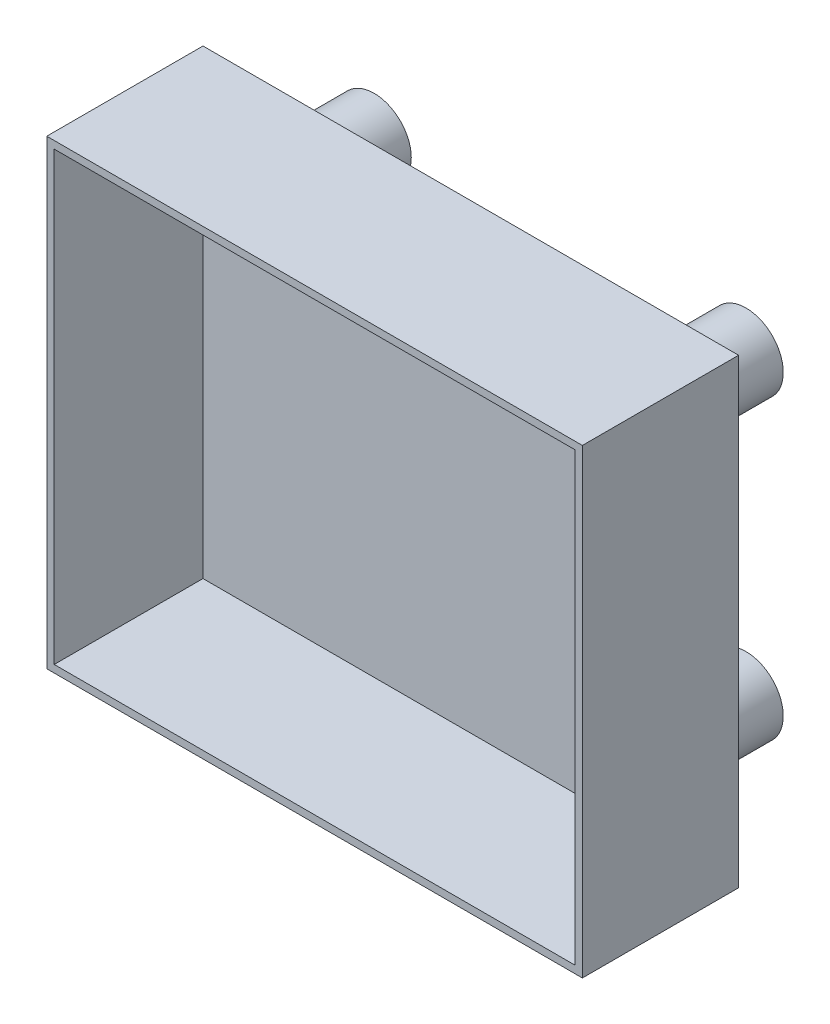
ISO-10303-21;
HEADER;
FILE_DESCRIPTION(('STEP AP214'),'2;1');
FILE_NAME('part.step','',(''),(''),'','','');
FILE_SCHEMA(('AUTOMOTIVE_DESIGN { 1 0 10303 214 1 1 1 1 }'));
ENDSEC;
DATA;
#1=APPLICATION_CONTEXT('core data for automotive mechanical design processes');
#2=APPLICATION_PROTOCOL_DEFINITION('international standard','automotive_design',2000,#1);
#3=PRODUCT_CONTEXT('',#1,'mechanical');
#4=PRODUCT('Part','Part','',(#3));
#5=PRODUCT_RELATED_PRODUCT_CATEGORY('part','',(#4));
#6=PRODUCT_DEFINITION_FORMATION('','',#4);
#7=PRODUCT_DEFINITION_CONTEXT('part definition',#1,'design');
#8=PRODUCT_DEFINITION('design','',#6,#7);
#9=PRODUCT_DEFINITION_SHAPE('','',#8);
#10=(LENGTH_UNIT() NAMED_UNIT(*) SI_UNIT(.MILLI.,.METRE.));
#11=(NAMED_UNIT(*) PLANE_ANGLE_UNIT() SI_UNIT($,.RADIAN.));
#12=(NAMED_UNIT(*) SI_UNIT($,.STERADIAN.) SOLID_ANGLE_UNIT());
#13=UNCERTAINTY_MEASURE_WITH_UNIT(LENGTH_MEASURE(1.E-05),#10,'distance_accuracy_value','');
#14=(GEOMETRIC_REPRESENTATION_CONTEXT(3) GLOBAL_UNCERTAINTY_ASSIGNED_CONTEXT((#13)) GLOBAL_UNIT_ASSIGNED_CONTEXT((#10,
#11,#12)) REPRESENTATION_CONTEXT('',''));
#15=CARTESIAN_POINT('',(0.,0.,0.));
#16=DIRECTION('',(0.,0.,1.));
#17=DIRECTION('',(1.,0.,0.));
#18=AXIS2_PLACEMENT_3D('',#15,#16,#17);
#19=CARTESIAN_POINT('',(0.,0.,50.8));
#20=DIRECTION('',(0.,0.,-1.));
#21=DIRECTION('',(-1.,0.,0.));
#22=AXIS2_PLACEMENT_3D('',#19,#20,#21);
#23=PLANE('',#22);
#24=DIRECTION('',(0.,1.,0.));
#25=VECTOR('',#24,1.);
#26=CARTESIAN_POINT('',(91.44,0.,50.8));
#27=LINE('',#26,#25);
#28=CARTESIAN_POINT('',(91.44,-78.74,50.8));
#29=VERTEX_POINT('',#28);
#30=CARTESIAN_POINT('',(91.44,78.74,50.8));
#31=VERTEX_POINT('',#30);
#32=EDGE_CURVE('E163',#29,#31,#27,.T.);
#33=ORIENTED_EDGE('',*,*,#32,.T.);
#34=DIRECTION('',(-1.,0.,0.));
#35=VECTOR('',#34,1.);
#36=CARTESIAN_POINT('',(0.,78.74,50.8));
#37=LINE('',#36,#35);
#38=CARTESIAN_POINT('',(-91.44,78.74,50.8));
#39=VERTEX_POINT('',#38);
#40=EDGE_CURVE('E165',#31,#39,#37,.T.);
#41=ORIENTED_EDGE('',*,*,#40,.T.);
#42=DIRECTION('',(0.,-1.,0.));
#43=VECTOR('',#42,1.);
#44=CARTESIAN_POINT('',(-91.44,0.,50.8));
#45=LINE('',#44,#43);
#46=CARTESIAN_POINT('',(-91.44,-78.74,50.8));
#47=VERTEX_POINT('',#46);
#48=EDGE_CURVE('E166',#39,#47,#45,.T.);
#49=ORIENTED_EDGE('',*,*,#48,.T.);
#50=DIRECTION('',(1.,0.,0.));
#51=VECTOR('',#50,1.);
#52=CARTESIAN_POINT('',(0.,-78.74,50.8));
#53=LINE('',#52,#51);
#54=EDGE_CURVE('E37',#47,#29,#53,.T.);
#55=ORIENTED_EDGE('',*,*,#54,.T.);
#56=EDGE_LOOP('',(#33,#41,#49,#55));
#57=FACE_BOUND('',#56,.T.);
#58=DIRECTION('',(0.,1.,0.));
#59=VECTOR('',#58,1.);
#60=CARTESIAN_POINT('',(88.9,-76.2,50.8));
#61=LINE('',#60,#59);
#62=CARTESIAN_POINT('',(88.9,-76.2,50.8));
#63=VERTEX_POINT('',#62);
#64=CARTESIAN_POINT('',(88.9,76.2,50.8));
#65=VERTEX_POINT('',#64);
#66=EDGE_CURVE('E102',#63,#65,#61,.T.);
#67=ORIENTED_EDGE('',*,*,#66,.F.);
#68=DIRECTION('',(1.,0.,0.));
#69=VECTOR('',#68,1.);
#70=CARTESIAN_POINT('',(-88.9,-76.2,50.8));
#71=LINE('',#70,#69);
#72=CARTESIAN_POINT('',(-88.9,-76.2,50.8));
#73=VERTEX_POINT('',#72);
#74=EDGE_CURVE('E127',#73,#63,#71,.T.);
#75=ORIENTED_EDGE('',*,*,#74,.F.);
#76=DIRECTION('',(0.,-1.,0.));
#77=VECTOR('',#76,1.);
#78=CARTESIAN_POINT('',(-88.9,-76.2,50.8));
#79=LINE('',#78,#77);
#80=CARTESIAN_POINT('',(-88.9,76.2,50.8));
#81=VERTEX_POINT('',#80);
#82=EDGE_CURVE('E125',#81,#73,#79,.T.);
#83=ORIENTED_EDGE('',*,*,#82,.F.);
#84=DIRECTION('',(-1.,0.,0.));
#85=VECTOR('',#84,1.);
#86=CARTESIAN_POINT('',(-88.9,76.2,50.8));
#87=LINE('',#86,#85);
#88=EDGE_CURVE('E113',#65,#81,#87,.T.);
#89=ORIENTED_EDGE('',*,*,#88,.F.);
#90=EDGE_LOOP('',(#67,#75,#83,#89));
#91=FACE_BOUND('',#90,.T.);
#92=ADVANCED_FACE('F33',(#57,#91),#23,.F.);
#93=CARTESIAN_POINT('',(91.44,-76.2,50.8));
#94=DIRECTION('',(-1.,0.,0.));
#95=DIRECTION('',(0.,0.,1.));
#96=AXIS2_PLACEMENT_3D('',#93,#94,#95);
#97=PLANE('',#96);
#98=DIRECTION('',(0.,1.,0.));
#99=VECTOR('',#98,1.);
#100=CARTESIAN_POINT('',(91.44,0.,-2.54));
#101=LINE('',#100,#99);
#102=CARTESIAN_POINT('',(91.44,-78.74,-2.54));
#103=VERTEX_POINT('',#102);
#104=CARTESIAN_POINT('',(91.44,78.74,-2.54));
#105=VERTEX_POINT('',#104);
#106=EDGE_CURVE('E121',#103,#105,#101,.T.);
#107=ORIENTED_EDGE('',*,*,#106,.T.);
#108=DIRECTION('',(0.,0.,-1.));
#109=VECTOR('',#108,1.);
#110=CARTESIAN_POINT('',(91.44,78.74,50.8));
#111=LINE('',#110,#109);
#112=EDGE_CURVE('E145',#31,#105,#111,.T.);
#113=ORIENTED_EDGE('',*,*,#112,.F.);
#114=ORIENTED_EDGE('',*,*,#32,.F.);
#115=DIRECTION('',(0.,0.,-1.));
#116=VECTOR('',#115,1.);
#117=CARTESIAN_POINT('',(91.44,-78.74,50.8));
#118=LINE('',#117,#116);
#119=EDGE_CURVE('E150',#29,#103,#118,.T.);
#120=ORIENTED_EDGE('',*,*,#119,.T.);
#121=EDGE_LOOP('',(#107,#113,#114,#120));
#122=FACE_BOUND('',#121,.T.);
#123=ADVANCED_FACE('F180',(#122),#97,.F.);
#124=CARTESIAN_POINT('',(-88.9,78.74,50.8));
#125=DIRECTION('',(0.,-1.,0.));
#126=DIRECTION('',(0.,0.,-1.));
#127=AXIS2_PLACEMENT_3D('',#124,#125,#126);
#128=PLANE('',#127);
#129=DIRECTION('',(-1.,0.,0.));
#130=VECTOR('',#129,1.);
#131=CARTESIAN_POINT('',(0.,78.74,-2.54));
#132=LINE('',#131,#130);
#133=CARTESIAN_POINT('',(-91.44,78.74,-2.54));
#134=VERTEX_POINT('',#133);
#135=EDGE_CURVE('E144',#105,#134,#132,.T.);
#136=ORIENTED_EDGE('',*,*,#135,.T.);
#137=DIRECTION('',(0.,0.,-1.));
#138=VECTOR('',#137,1.);
#139=CARTESIAN_POINT('',(-91.44,78.74,50.8));
#140=LINE('',#139,#138);
#141=EDGE_CURVE('E149',#39,#134,#140,.T.);
#142=ORIENTED_EDGE('',*,*,#141,.F.);
#143=ORIENTED_EDGE('',*,*,#40,.F.);
#144=ORIENTED_EDGE('',*,*,#112,.T.);
#145=EDGE_LOOP('',(#136,#142,#143,#144));
#146=FACE_BOUND('',#145,.T.);
#147=ADVANCED_FACE('F182',(#146),#128,.F.);
#148=CARTESIAN_POINT('',(-91.44,-76.2,50.8));
#149=DIRECTION('',(1.,0.,0.));
#150=DIRECTION('',(0.,0.,-1.));
#151=AXIS2_PLACEMENT_3D('',#148,#149,#150);
#152=PLANE('',#151);
#153=DIRECTION('',(0.,-1.,0.));
#154=VECTOR('',#153,1.);
#155=CARTESIAN_POINT('',(-91.44,0.,-2.54));
#156=LINE('',#155,#154);
#157=CARTESIAN_POINT('',(-91.44,-78.74,-2.54));
#158=VERTEX_POINT('',#157);
#159=EDGE_CURVE('E155',#134,#158,#156,.T.);
#160=ORIENTED_EDGE('',*,*,#159,.T.);
#161=DIRECTION('',(0.,0.,-1.));
#162=VECTOR('',#161,1.);
#163=CARTESIAN_POINT('',(-91.44,-78.74,50.8));
#164=LINE('',#163,#162);
#165=EDGE_CURVE('E153',#47,#158,#164,.T.);
#166=ORIENTED_EDGE('',*,*,#165,.F.);
#167=ORIENTED_EDGE('',*,*,#48,.F.);
#168=ORIENTED_EDGE('',*,*,#141,.T.);
#169=EDGE_LOOP('',(#160,#166,#167,#168));
#170=FACE_BOUND('',#169,.T.);
#171=ADVANCED_FACE('F171',(#170),#152,.F.);
#172=CARTESIAN_POINT('',(-88.9,-78.74,50.8));
#173=DIRECTION('',(0.,1.,0.));
#174=DIRECTION('',(0.,0.,1.));
#175=AXIS2_PLACEMENT_3D('',#172,#173,#174);
#176=PLANE('',#175);
#177=DIRECTION('',(1.,0.,0.));
#178=VECTOR('',#177,1.);
#179=CARTESIAN_POINT('',(0.,-78.74,-2.54));
#180=LINE('',#179,#178);
#181=EDGE_CURVE('E159',#158,#103,#180,.T.);
#182=ORIENTED_EDGE('',*,*,#181,.T.);
#183=ORIENTED_EDGE('',*,*,#119,.F.);
#184=ORIENTED_EDGE('',*,*,#54,.F.);
#185=ORIENTED_EDGE('',*,*,#165,.T.);
#186=EDGE_LOOP('',(#182,#183,#184,#185));
#187=FACE_BOUND('',#186,.T.);
#188=ADVANCED_FACE('F175',(#187),#176,.F.);
#189=CARTESIAN_POINT('',(0.,0.,-2.54));
#190=DIRECTION('',(0.,0.,-1.));
#191=DIRECTION('',(-1.,0.,0.));
#192=AXIS2_PLACEMENT_3D('',#189,#190,#191);
#193=PLANE('',#192);
#194=CARTESIAN_POINT('',(-63.5,50.8,-2.54));
#195=DIRECTION('',(0.,0.,-1.));
#196=DIRECTION('',(-1.,0.,0.));
#197=AXIS2_PLACEMENT_3D('',#194,#195,#196);
#198=CIRCLE('',#197,12.7);
#199=CARTESIAN_POINT('',(-76.2,50.8,-2.54));
#200=VERTEX_POINT('',#199);
#201=EDGE_CURVE('E11',#200,#200,#198,.T.);
#202=ORIENTED_EDGE('',*,*,#201,.F.);
#203=EDGE_LOOP('',(#202));
#204=FACE_BOUND('',#203,.T.);
#205=CARTESIAN_POINT('',(63.5,50.8,-2.54));
#206=DIRECTION('',(0.,0.,-1.));
#207=DIRECTION('',(-1.,0.,0.));
#208=AXIS2_PLACEMENT_3D('',#205,#206,#207);
#209=CIRCLE('',#208,12.7);
#210=CARTESIAN_POINT('',(50.8,50.8,-2.54));
#211=VERTEX_POINT('',#210);
#212=EDGE_CURVE('E42',#211,#211,#209,.T.);
#213=ORIENTED_EDGE('',*,*,#212,.F.);
#214=EDGE_LOOP('',(#213));
#215=FACE_BOUND('',#214,.T.);
#216=CARTESIAN_POINT('',(63.5,-50.8,-2.54));
#217=DIRECTION('',(0.,0.,-1.));
#218=DIRECTION('',(-1.,0.,0.));
#219=AXIS2_PLACEMENT_3D('',#216,#217,#218);
#220=CIRCLE('',#219,12.7);
#221=CARTESIAN_POINT('',(50.8,-50.8,-2.54));
#222=VERTEX_POINT('',#221);
#223=EDGE_CURVE('E356',#222,#222,#220,.T.);
#224=ORIENTED_EDGE('',*,*,#223,.F.);
#225=EDGE_LOOP('',(#224));
#226=FACE_BOUND('',#225,.T.);
#227=CARTESIAN_POINT('',(-63.5,-50.8,-2.54));
#228=DIRECTION('',(0.,0.,-1.));
#229=DIRECTION('',(-1.,0.,0.));
#230=AXIS2_PLACEMENT_3D('',#227,#228,#229);
#231=CIRCLE('',#230,12.7);
#232=CARTESIAN_POINT('',(-76.2,-50.8,-2.54));
#233=VERTEX_POINT('',#232);
#234=EDGE_CURVE('E148',#233,#233,#231,.T.);
#235=ORIENTED_EDGE('',*,*,#234,.F.);
#236=EDGE_LOOP('',(#235));
#237=FACE_BOUND('',#236,.T.);
#238=ORIENTED_EDGE('',*,*,#106,.F.);
#239=ORIENTED_EDGE('',*,*,#181,.F.);
#240=ORIENTED_EDGE('',*,*,#159,.F.);
#241=ORIENTED_EDGE('',*,*,#135,.F.);
#242=EDGE_LOOP('',(#238,#239,#240,#241));
#243=FACE_BOUND('',#242,.T.);
#244=ADVANCED_FACE('F35',(#204,#215,#226,#237,#243),#193,.T.);
#245=CARTESIAN_POINT('',(88.9,-76.2,50.8));
#246=DIRECTION('',(-1.,0.,0.));
#247=DIRECTION('',(0.,0.,1.));
#248=AXIS2_PLACEMENT_3D('',#245,#246,#247);
#249=PLANE('',#248);
#250=DIRECTION('',(0.,1.,0.));
#251=VECTOR('',#250,1.);
#252=CARTESIAN_POINT('',(88.9,-76.2,0.));
#253=LINE('',#252,#251);
#254=CARTESIAN_POINT('',(88.9,-76.2,0.));
#255=VERTEX_POINT('',#254);
#256=CARTESIAN_POINT('',(88.9,76.2,0.));
#257=VERTEX_POINT('',#256);
#258=EDGE_CURVE('E132',#255,#257,#253,.T.);
#259=ORIENTED_EDGE('',*,*,#258,.F.);
#260=DIRECTION('',(0.,0.,-1.));
#261=VECTOR('',#260,1.);
#262=CARTESIAN_POINT('',(88.9,-76.2,50.8));
#263=LINE('',#262,#261);
#264=EDGE_CURVE('E109',#63,#255,#263,.T.);
#265=ORIENTED_EDGE('',*,*,#264,.F.);
#266=ORIENTED_EDGE('',*,*,#66,.T.);
#267=DIRECTION('',(0.,0.,-1.));
#268=VECTOR('',#267,1.);
#269=CARTESIAN_POINT('',(88.9,76.2,50.8));
#270=LINE('',#269,#268);
#271=EDGE_CURVE('E106',#65,#257,#270,.T.);
#272=ORIENTED_EDGE('',*,*,#271,.T.);
#273=EDGE_LOOP('',(#259,#265,#266,#272));
#274=FACE_BOUND('',#273,.T.);
#275=ADVANCED_FACE('F105',(#274),#249,.T.);
#276=CARTESIAN_POINT('',(-88.9,76.2,50.8));
#277=DIRECTION('',(0.,-1.,0.));
#278=DIRECTION('',(0.,0.,-1.));
#279=AXIS2_PLACEMENT_3D('',#276,#277,#278);
#280=PLANE('',#279);
#281=DIRECTION('',(-1.,0.,0.));
#282=VECTOR('',#281,1.);
#283=CARTESIAN_POINT('',(-88.9,76.2,0.));
#284=LINE('',#283,#282);
#285=CARTESIAN_POINT('',(-88.9,76.2,0.));
#286=VERTEX_POINT('',#285);
#287=EDGE_CURVE('E120',#257,#286,#284,.T.);
#288=ORIENTED_EDGE('',*,*,#287,.F.);
#289=ORIENTED_EDGE('',*,*,#271,.F.);
#290=ORIENTED_EDGE('',*,*,#88,.T.);
#291=DIRECTION('',(0.,0.,-1.));
#292=VECTOR('',#291,1.);
#293=CARTESIAN_POINT('',(-88.9,76.2,50.8));
#294=LINE('',#293,#292);
#295=EDGE_CURVE('E122',#81,#286,#294,.T.);
#296=ORIENTED_EDGE('',*,*,#295,.T.);
#297=EDGE_LOOP('',(#288,#289,#290,#296));
#298=FACE_BOUND('',#297,.T.);
#299=ADVANCED_FACE('F117',(#298),#280,.T.);
#300=CARTESIAN_POINT('',(-88.9,-76.2,50.8));
#301=DIRECTION('',(1.,0.,0.));
#302=DIRECTION('',(0.,0.,-1.));
#303=AXIS2_PLACEMENT_3D('',#300,#301,#302);
#304=PLANE('',#303);
#305=DIRECTION('',(0.,-1.,0.));
#306=VECTOR('',#305,1.);
#307=CARTESIAN_POINT('',(-88.9,-76.2,0.));
#308=LINE('',#307,#306);
#309=CARTESIAN_POINT('',(-88.9,-76.2,0.));
#310=VERTEX_POINT('',#309);
#311=EDGE_CURVE('E136',#286,#310,#308,.T.);
#312=ORIENTED_EDGE('',*,*,#311,.F.);
#313=ORIENTED_EDGE('',*,*,#295,.F.);
#314=ORIENTED_EDGE('',*,*,#82,.T.);
#315=DIRECTION('',(0.,0.,-1.));
#316=VECTOR('',#315,1.);
#317=CARTESIAN_POINT('',(-88.9,-76.2,50.8));
#318=LINE('',#317,#316);
#319=EDGE_CURVE('E50',#73,#310,#318,.T.);
#320=ORIENTED_EDGE('',*,*,#319,.T.);
#321=EDGE_LOOP('',(#312,#313,#314,#320));
#322=FACE_BOUND('',#321,.T.);
#323=ADVANCED_FACE('F229',(#322),#304,.T.);
#324=CARTESIAN_POINT('',(-88.9,-76.2,50.8));
#325=DIRECTION('',(0.,1.,0.));
#326=DIRECTION('',(0.,0.,1.));
#327=AXIS2_PLACEMENT_3D('',#324,#325,#326);
#328=PLANE('',#327);
#329=DIRECTION('',(1.,0.,0.));
#330=VECTOR('',#329,1.);
#331=CARTESIAN_POINT('',(-88.9,-76.2,0.));
#332=LINE('',#331,#330);
#333=EDGE_CURVE('E114',#310,#255,#332,.T.);
#334=ORIENTED_EDGE('',*,*,#333,.F.);
#335=ORIENTED_EDGE('',*,*,#319,.F.);
#336=ORIENTED_EDGE('',*,*,#74,.T.);
#337=ORIENTED_EDGE('',*,*,#264,.T.);
#338=EDGE_LOOP('',(#334,#335,#336,#337));
#339=FACE_BOUND('',#338,.T.);
#340=ADVANCED_FACE('F237',(#339),#328,.T.);
#341=CARTESIAN_POINT('',(0.,0.,0.));
#342=DIRECTION('',(0.,0.,-1.));
#343=DIRECTION('',(-1.,0.,0.));
#344=AXIS2_PLACEMENT_3D('',#341,#342,#343);
#345=PLANE('',#344);
#346=ORIENTED_EDGE('',*,*,#258,.T.);
#347=ORIENTED_EDGE('',*,*,#287,.T.);
#348=ORIENTED_EDGE('',*,*,#311,.T.);
#349=ORIENTED_EDGE('',*,*,#333,.T.);
#350=EDGE_LOOP('',(#346,#347,#348,#349));
#351=FACE_BOUND('',#350,.T.);
#352=ADVANCED_FACE('F246',(#351),#345,.F.);
#353=CARTESIAN_POINT('',(-63.5,-50.8,-33.02));
#354=DIRECTION('',(0.,0.,1.));
#355=DIRECTION('',(1.,0.,0.));
#356=AXIS2_PLACEMENT_3D('',#353,#354,#355);
#357=CYLINDRICAL_SURFACE('',#356,12.7);
#358=ORIENTED_EDGE('',*,*,#234,.T.);
#359=EDGE_LOOP('',(#358));
#360=FACE_BOUND('',#359,.T.);
#361=CARTESIAN_POINT('',(-63.5,-50.8,-33.02));
#362=DIRECTION('',(0.,0.,1.));
#363=DIRECTION('',(1.,0.,0.));
#364=AXIS2_PLACEMENT_3D('',#361,#362,#363);
#365=CIRCLE('',#364,12.7);
#366=CARTESIAN_POINT('',(-50.8,-50.8,-33.02));
#367=VERTEX_POINT('',#366);
#368=EDGE_CURVE('E134',#367,#367,#365,.T.);
#369=ORIENTED_EDGE('',*,*,#368,.T.);
#370=EDGE_LOOP('',(#369));
#371=FACE_BOUND('',#370,.T.);
#372=ADVANCED_FACE('F260',(#360,#371),#357,.T.);
#373=CARTESIAN_POINT('',(-63.5,-50.8,-33.02));
#374=DIRECTION('',(0.,0.,1.));
#375=DIRECTION('',(1.,0.,0.));
#376=AXIS2_PLACEMENT_3D('',#373,#374,#375);
#377=PLANE('',#376);
#378=ORIENTED_EDGE('',*,*,#368,.F.);
#379=EDGE_LOOP('',(#378));
#380=FACE_BOUND('',#379,.T.);
#381=ADVANCED_FACE('F270',(#380),#377,.F.);
#382=CARTESIAN_POINT('',(63.5,-50.8,-33.02));
#383=DIRECTION('',(0.,0.,1.));
#384=DIRECTION('',(1.,0.,0.));
#385=AXIS2_PLACEMENT_3D('',#382,#383,#384);
#386=CYLINDRICAL_SURFACE('',#385,12.7);
#387=ORIENTED_EDGE('',*,*,#223,.T.);
#388=EDGE_LOOP('',(#387));
#389=FACE_BOUND('',#388,.T.);
#390=CARTESIAN_POINT('',(63.5,-50.8,-33.02));
#391=DIRECTION('',(0.,0.,1.));
#392=DIRECTION('',(1.,0.,0.));
#393=AXIS2_PLACEMENT_3D('',#390,#391,#392);
#394=CIRCLE('',#393,12.7);
#395=CARTESIAN_POINT('',(76.2,-50.8,-33.02));
#396=VERTEX_POINT('',#395);
#397=EDGE_CURVE('E351',#396,#396,#394,.T.);
#398=ORIENTED_EDGE('',*,*,#397,.T.);
#399=EDGE_LOOP('',(#398));
#400=FACE_BOUND('',#399,.T.);
#401=ADVANCED_FACE('F280',(#389,#400),#386,.T.);
#402=CARTESIAN_POINT('',(63.5,-50.8,-33.02));
#403=DIRECTION('',(0.,0.,1.));
#404=DIRECTION('',(1.,0.,0.));
#405=AXIS2_PLACEMENT_3D('',#402,#403,#404);
#406=PLANE('',#405);
#407=ORIENTED_EDGE('',*,*,#397,.F.);
#408=EDGE_LOOP('',(#407));
#409=FACE_BOUND('',#408,.T.);
#410=ADVANCED_FACE('F290',(#409),#406,.F.);
#411=CARTESIAN_POINT('',(63.5,50.8,-33.02));
#412=DIRECTION('',(0.,0.,1.));
#413=DIRECTION('',(1.,0.,0.));
#414=AXIS2_PLACEMENT_3D('',#411,#412,#413);
#415=CYLINDRICAL_SURFACE('',#414,12.7);
#416=ORIENTED_EDGE('',*,*,#212,.T.);
#417=EDGE_LOOP('',(#416));
#418=FACE_BOUND('',#417,.T.);
#419=CARTESIAN_POINT('',(63.5,50.8,-33.02));
#420=DIRECTION('',(0.,0.,1.));
#421=DIRECTION('',(1.,0.,0.));
#422=AXIS2_PLACEMENT_3D('',#419,#420,#421);
#423=CIRCLE('',#422,12.7);
#424=CARTESIAN_POINT('',(76.2,50.8,-33.02));
#425=VERTEX_POINT('',#424);
#426=EDGE_CURVE('E348',#425,#425,#423,.T.);
#427=ORIENTED_EDGE('',*,*,#426,.T.);
#428=EDGE_LOOP('',(#427));
#429=FACE_BOUND('',#428,.T.);
#430=ADVANCED_FACE('F300',(#418,#429),#415,.T.);
#431=CARTESIAN_POINT('',(63.5,50.8,-33.02));
#432=DIRECTION('',(0.,0.,1.));
#433=DIRECTION('',(1.,0.,0.));
#434=AXIS2_PLACEMENT_3D('',#431,#432,#433);
#435=PLANE('',#434);
#436=ORIENTED_EDGE('',*,*,#426,.F.);
#437=EDGE_LOOP('',(#436));
#438=FACE_BOUND('',#437,.T.);
#439=ADVANCED_FACE('F310',(#438),#435,.F.);
#440=CARTESIAN_POINT('',(-63.5,50.8,-33.02));
#441=DIRECTION('',(0.,0.,1.));
#442=DIRECTION('',(1.,0.,0.));
#443=AXIS2_PLACEMENT_3D('',#440,#441,#442);
#444=CYLINDRICAL_SURFACE('',#443,12.7);
#445=ORIENTED_EDGE('',*,*,#201,.T.);
#446=EDGE_LOOP('',(#445));
#447=FACE_BOUND('',#446,.T.);
#448=CARTESIAN_POINT('',(-63.5,50.8,-33.02));
#449=DIRECTION('',(0.,0.,1.));
#450=DIRECTION('',(1.,0.,0.));
#451=AXIS2_PLACEMENT_3D('',#448,#449,#450);
#452=CIRCLE('',#451,12.7);
#453=CARTESIAN_POINT('',(-50.8,50.8,-33.02));
#454=VERTEX_POINT('',#453);
#455=EDGE_CURVE('E346',#454,#454,#452,.T.);
#456=ORIENTED_EDGE('',*,*,#455,.T.);
#457=EDGE_LOOP('',(#456));
#458=FACE_BOUND('',#457,.T.);
#459=ADVANCED_FACE('F320',(#447,#458),#444,.T.);
#460=CARTESIAN_POINT('',(-63.5,50.8,-33.02));
#461=DIRECTION('',(0.,0.,1.));
#462=DIRECTION('',(1.,0.,0.));
#463=AXIS2_PLACEMENT_3D('',#460,#461,#462);
#464=PLANE('',#463);
#465=ORIENTED_EDGE('',*,*,#455,.F.);
#466=EDGE_LOOP('',(#465));
#467=FACE_BOUND('',#466,.T.);
#468=ADVANCED_FACE('F330',(#467),#464,.F.);
#469=CLOSED_SHELL('',(#92,#123,#147,#171,#188,#244,#275,#299,#323,#340,#352,#372,#381,#401,#410,
#430,#439,#459,#468));
#470=MANIFOLD_SOLID_BREP('B2',#469);
#471=ADVANCED_BREP_SHAPE_REPRESENTATION('',(#18,#470),#14);
#472=SHAPE_DEFINITION_REPRESENTATION(#9,#471);
ENDSEC;
END-ISO-10303-21;
